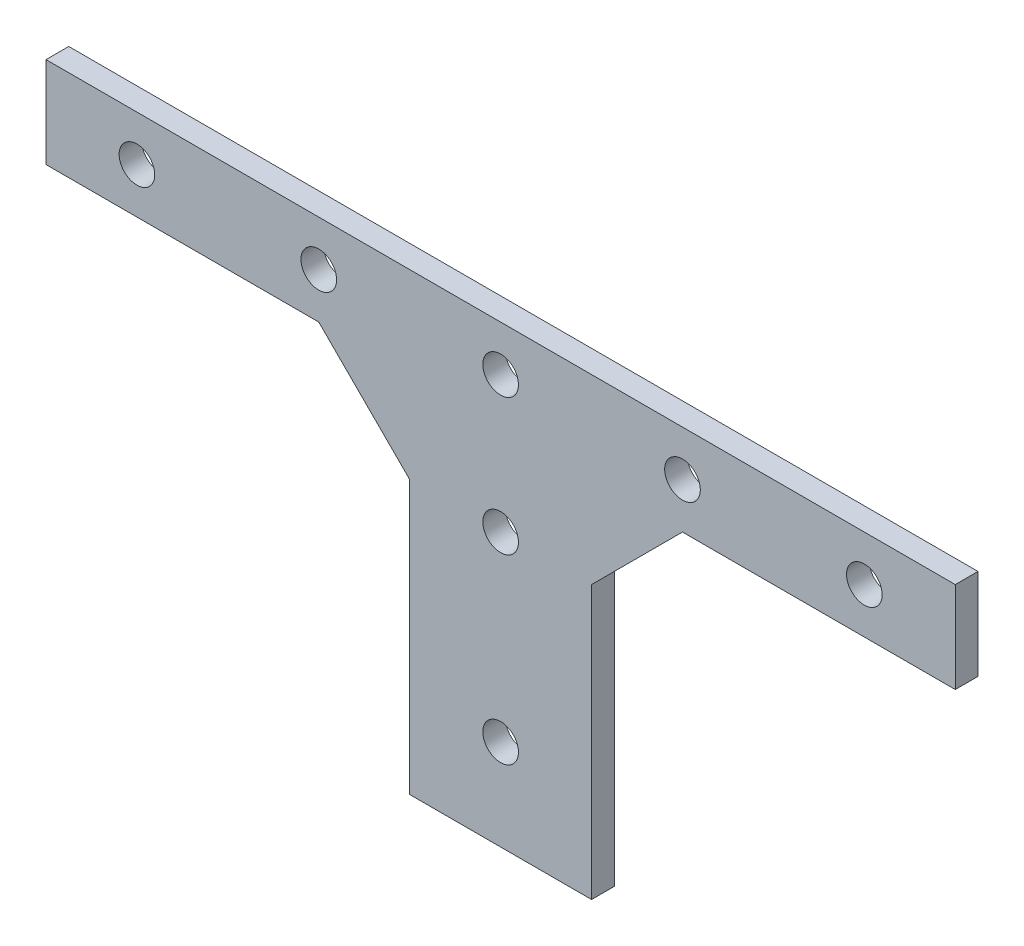
ISO-10303-21;
HEADER;
FILE_DESCRIPTION(('STEP AP214'),'2;1');
FILE_NAME('part.step','',(''),(''),'','','');
FILE_SCHEMA(('AUTOMOTIVE_DESIGN { 1 0 10303 214 1 1 1 1 }'));
ENDSEC;
DATA;
#1=APPLICATION_CONTEXT('core data for automotive mechanical design processes');
#2=APPLICATION_PROTOCOL_DEFINITION('international standard','automotive_design',2000,#1);
#3=PRODUCT_CONTEXT('',#1,'mechanical');
#4=PRODUCT('Part','Part','',(#3));
#5=PRODUCT_RELATED_PRODUCT_CATEGORY('part','',(#4));
#6=PRODUCT_DEFINITION_FORMATION('','',#4);
#7=PRODUCT_DEFINITION_CONTEXT('part definition',#1,'design');
#8=PRODUCT_DEFINITION('design','',#6,#7);
#9=PRODUCT_DEFINITION_SHAPE('','',#8);
#10=(LENGTH_UNIT() NAMED_UNIT(*) SI_UNIT(.MILLI.,.METRE.));
#11=(NAMED_UNIT(*) PLANE_ANGLE_UNIT() SI_UNIT($,.RADIAN.));
#12=(NAMED_UNIT(*) SI_UNIT($,.STERADIAN.) SOLID_ANGLE_UNIT());
#13=UNCERTAINTY_MEASURE_WITH_UNIT(LENGTH_MEASURE(1.E-05),#10,'distance_accuracy_value','');
#14=(GEOMETRIC_REPRESENTATION_CONTEXT(3) GLOBAL_UNCERTAINTY_ASSIGNED_CONTEXT((#13)) GLOBAL_UNIT_ASSIGNED_CONTEXT((#10,
#11,#12)) REPRESENTATION_CONTEXT('',''));
#15=CARTESIAN_POINT('',(0.,0.,0.));
#16=DIRECTION('',(0.,0.,1.));
#17=DIRECTION('',(1.,0.,0.));
#18=AXIS2_PLACEMENT_3D('',#15,#16,#17);
#19=CARTESIAN_POINT('',(41.2749999999985,-63.5,3.175));
#20=DIRECTION('',(0.,1.,0.));
#21=DIRECTION('',(0.,0.,1.));
#22=AXIS2_PLACEMENT_3D('',#19,#20,#21);
#23=PLANE('',#22);
#24=DIRECTION('',(1.,0.,0.));
#25=VECTOR('',#24,1.);
#26=CARTESIAN_POINT('',(41.2749999999985,-63.5,0.));
#27=LINE('',#26,#25);
#28=CARTESIAN_POINT('',(41.2749999999985,-63.5,0.));
#29=VERTEX_POINT('',#28);
#30=CARTESIAN_POINT('',(66.6749999999986,-63.5,0.));
#31=VERTEX_POINT('',#30);
#32=EDGE_CURVE('E155',#29,#31,#27,.T.);
#33=ORIENTED_EDGE('',*,*,#32,.T.);
#34=DIRECTION('',(0.,0.,-1.));
#35=VECTOR('',#34,1.);
#36=CARTESIAN_POINT('',(66.6749999999986,-63.5,3.175));
#37=LINE('',#36,#35);
#38=CARTESIAN_POINT('',(66.6749999999986,-63.5,3.175));
#39=VERTEX_POINT('',#38);
#40=EDGE_CURVE('E11',#39,#31,#37,.T.);
#41=ORIENTED_EDGE('',*,*,#40,.F.);
#42=DIRECTION('',(1.,0.,0.));
#43=VECTOR('',#42,1.);
#44=CARTESIAN_POINT('',(41.2749999999985,-63.5,3.175));
#45=LINE('',#44,#43);
#46=CARTESIAN_POINT('',(41.2749999999985,-63.5,3.175));
#47=VERTEX_POINT('',#46);
#48=EDGE_CURVE('E184',#47,#39,#45,.T.);
#49=ORIENTED_EDGE('',*,*,#48,.F.);
#50=DIRECTION('',(0.,0.,-1.));
#51=VECTOR('',#50,1.);
#52=CARTESIAN_POINT('',(41.2749999999985,-63.5,3.175));
#53=LINE('',#52,#51);
#54=EDGE_CURVE('E151',#47,#29,#53,.T.);
#55=ORIENTED_EDGE('',*,*,#54,.T.);
#56=EDGE_LOOP('',(#33,#41,#49,#55));
#57=FACE_BOUND('',#56,.T.);
#58=ADVANCED_FACE('F42',(#57),#23,.F.);
#59=CARTESIAN_POINT('',(66.6749999999986,-63.5,3.175));
#60=DIRECTION('',(-1.,0.,0.));
#61=DIRECTION('',(0.,0.,1.));
#62=AXIS2_PLACEMENT_3D('',#59,#60,#61);
#63=PLANE('',#62);
#64=DIRECTION('',(0.,1.,0.));
#65=VECTOR('',#64,1.);
#66=CARTESIAN_POINT('',(66.6749999999986,-63.5,0.));
#67=LINE('',#66,#65);
#68=CARTESIAN_POINT('',(66.6749999999986,-25.4,0.));
#69=VERTEX_POINT('',#68);
#70=EDGE_CURVE('E159',#31,#69,#67,.T.);
#71=ORIENTED_EDGE('',*,*,#70,.T.);
#72=DIRECTION('',(0.,0.,-1.));
#73=VECTOR('',#72,1.);
#74=CARTESIAN_POINT('',(66.6749999999986,-25.4,3.175));
#75=LINE('',#74,#73);
#76=CARTESIAN_POINT('',(66.6749999999986,-25.4,3.175));
#77=VERTEX_POINT('',#76);
#78=EDGE_CURVE('E51',#77,#69,#75,.T.);
#79=ORIENTED_EDGE('',*,*,#78,.F.);
#80=DIRECTION('',(0.,1.,0.));
#81=VECTOR('',#80,1.);
#82=CARTESIAN_POINT('',(66.6749999999986,-63.5,3.175));
#83=LINE('',#82,#81);
#84=EDGE_CURVE('E108',#39,#77,#83,.T.);
#85=ORIENTED_EDGE('',*,*,#84,.F.);
#86=ORIENTED_EDGE('',*,*,#40,.T.);
#87=EDGE_LOOP('',(#71,#79,#85,#86));
#88=FACE_BOUND('',#87,.T.);
#89=ADVANCED_FACE('F336',(#88),#63,.F.);
#90=CARTESIAN_POINT('',(66.6749999999986,-25.4,3.175));
#91=DIRECTION('',(-0.707106781186562,0.707106781186533,0.));
#92=DIRECTION('',(-0.707106781186533,-0.707106781186562,0.));
#93=AXIS2_PLACEMENT_3D('',#90,#91,#92);
#94=PLANE('',#93);
#95=DIRECTION('',(0.707106781186533,0.707106781186562,0.));
#96=VECTOR('',#95,1.);
#97=CARTESIAN_POINT('',(66.6749999999986,-25.4,0.));
#98=LINE('',#97,#96);
#99=CARTESIAN_POINT('',(79.3749999999981,-12.7,0.));
#100=VERTEX_POINT('',#99);
#101=EDGE_CURVE('E163',#69,#100,#98,.T.);
#102=ORIENTED_EDGE('',*,*,#101,.T.);
#103=DIRECTION('',(0.,0.,-1.));
#104=VECTOR('',#103,1.);
#105=CARTESIAN_POINT('',(79.3749999999981,-12.7,3.175));
#106=LINE('',#105,#104);
#107=CARTESIAN_POINT('',(79.3749999999981,-12.7,3.175));
#108=VERTEX_POINT('',#107);
#109=EDGE_CURVE('E203',#108,#100,#106,.T.);
#110=ORIENTED_EDGE('',*,*,#109,.F.);
#111=DIRECTION('',(0.707106781186533,0.707106781186562,0.));
#112=VECTOR('',#111,1.);
#113=CARTESIAN_POINT('',(66.6749999999986,-25.4,3.175));
#114=LINE('',#113,#112);
#115=EDGE_CURVE('E213',#77,#108,#114,.T.);
#116=ORIENTED_EDGE('',*,*,#115,.F.);
#117=ORIENTED_EDGE('',*,*,#78,.T.);
#118=EDGE_LOOP('',(#102,#110,#116,#117));
#119=FACE_BOUND('',#118,.T.);
#120=ADVANCED_FACE('F211',(#119),#94,.F.);
#121=CARTESIAN_POINT('',(79.3749999999981,-12.7,3.175));
#122=DIRECTION('',(0.,1.,0.));
#123=DIRECTION('',(-1.,0.,0.));
#124=AXIS2_PLACEMENT_3D('',#121,#122,#123);
#125=PLANE('',#124);
#126=DIRECTION('',(1.,0.,0.));
#127=VECTOR('',#126,1.);
#128=CARTESIAN_POINT('',(79.3749999999981,-12.7,0.));
#129=LINE('',#128,#127);
#130=CARTESIAN_POINT('',(117.474999999999,-12.6999999999999,0.));
#131=VERTEX_POINT('',#130);
#132=EDGE_CURVE('E166',#100,#131,#129,.T.);
#133=ORIENTED_EDGE('',*,*,#132,.T.);
#134=DIRECTION('',(0.,0.,-1.));
#135=VECTOR('',#134,1.);
#136=CARTESIAN_POINT('',(117.474999999999,-12.6999999999999,3.175));
#137=LINE('',#136,#135);
#138=CARTESIAN_POINT('',(117.474999999999,-12.6999999999999,3.175));
#139=VERTEX_POINT('',#138);
#140=EDGE_CURVE('E199',#139,#131,#137,.T.);
#141=ORIENTED_EDGE('',*,*,#140,.F.);
#142=DIRECTION('',(1.,0.,0.));
#143=VECTOR('',#142,1.);
#144=CARTESIAN_POINT('',(79.3749999999981,-12.7,3.175));
#145=LINE('',#144,#143);
#146=EDGE_CURVE('E232',#108,#139,#145,.T.);
#147=ORIENTED_EDGE('',*,*,#146,.F.);
#148=ORIENTED_EDGE('',*,*,#109,.T.);
#149=EDGE_LOOP('',(#133,#141,#147,#148));
#150=FACE_BOUND('',#149,.T.);
#151=ADVANCED_FACE('F222',(#150),#125,.F.);
#152=CARTESIAN_POINT('',(117.474999999999,-12.6999999999999,3.175));
#153=DIRECTION('',(-1.,0.,0.));
#154=DIRECTION('',(0.,0.,1.));
#155=AXIS2_PLACEMENT_3D('',#152,#153,#154);
#156=PLANE('',#155);
#157=DIRECTION('',(0.,1.,0.));
#158=VECTOR('',#157,1.);
#159=CARTESIAN_POINT('',(117.474999999999,-12.6999999999999,0.));
#160=LINE('',#159,#158);
#161=CARTESIAN_POINT('',(117.474999999999,-3.33066907387547E-13,0.));
#162=VERTEX_POINT('',#161);
#163=EDGE_CURVE('E169',#131,#162,#160,.T.);
#164=ORIENTED_EDGE('',*,*,#163,.T.);
#165=DIRECTION('',(0.,0.,-1.));
#166=VECTOR('',#165,1.);
#167=CARTESIAN_POINT('',(117.474999999999,-3.33066907387547E-13,3.175));
#168=LINE('',#167,#166);
#169=CARTESIAN_POINT('',(117.474999999999,-3.33066907387547E-13,3.175));
#170=VERTEX_POINT('',#169);
#171=EDGE_CURVE('E195',#170,#162,#168,.T.);
#172=ORIENTED_EDGE('',*,*,#171,.F.);
#173=DIRECTION('',(0.,1.,0.));
#174=VECTOR('',#173,1.);
#175=CARTESIAN_POINT('',(117.474999999999,-12.6999999999999,3.175));
#176=LINE('',#175,#174);
#177=EDGE_CURVE('E228',#139,#170,#176,.T.);
#178=ORIENTED_EDGE('',*,*,#177,.F.);
#179=ORIENTED_EDGE('',*,*,#140,.T.);
#180=EDGE_LOOP('',(#164,#172,#178,#179));
#181=FACE_BOUND('',#180,.T.);
#182=ADVANCED_FACE('F226',(#181),#156,.F.);
#183=CARTESIAN_POINT('',(117.474999999999,-3.33066907387547E-13,3.175));
#184=DIRECTION('',(0.,-1.,0.));
#185=DIRECTION('',(0.,0.,-1.));
#186=AXIS2_PLACEMENT_3D('',#183,#184,#185);
#187=PLANE('',#186);
#188=DIRECTION('',(-1.,0.,0.));
#189=VECTOR('',#188,1.);
#190=CARTESIAN_POINT('',(117.474999999999,-3.33066907387547E-13,0.));
#191=LINE('',#190,#189);
#192=CARTESIAN_POINT('',(-9.52500000000145,-3.33066907387547E-13,0.));
#193=VERTEX_POINT('',#192);
#194=EDGE_CURVE('E172',#162,#193,#191,.T.);
#195=ORIENTED_EDGE('',*,*,#194,.T.);
#196=DIRECTION('',(0.,0.,-1.));
#197=VECTOR('',#196,1.);
#198=CARTESIAN_POINT('',(-9.52500000000145,-3.33066907387547E-13,3.175));
#199=LINE('',#198,#197);
#200=CARTESIAN_POINT('',(-9.52500000000145,-3.33066907387547E-13,3.175));
#201=VERTEX_POINT('',#200);
#202=EDGE_CURVE('E191',#201,#193,#199,.T.);
#203=ORIENTED_EDGE('',*,*,#202,.F.);
#204=DIRECTION('',(-1.,0.,0.));
#205=VECTOR('',#204,1.);
#206=CARTESIAN_POINT('',(117.474999999999,-3.33066907387547E-13,3.175));
#207=LINE('',#206,#205);
#208=EDGE_CURVE('E231',#170,#201,#207,.T.);
#209=ORIENTED_EDGE('',*,*,#208,.F.);
#210=ORIENTED_EDGE('',*,*,#171,.T.);
#211=EDGE_LOOP('',(#195,#203,#209,#210));
#212=FACE_BOUND('',#211,.T.);
#213=ADVANCED_FACE('F348',(#212),#187,.F.);
#214=CARTESIAN_POINT('',(-9.52500000000145,-3.33066907387547E-13,3.175));
#215=DIRECTION('',(1.,0.,0.));
#216=DIRECTION('',(0.,0.,-1.));
#217=AXIS2_PLACEMENT_3D('',#214,#215,#216);
#218=PLANE('',#217);
#219=DIRECTION('',(0.,-1.,0.));
#220=VECTOR('',#219,1.);
#221=CARTESIAN_POINT('',(-9.52500000000145,-3.33066907387547E-13,0.));
#222=LINE('',#221,#220);
#223=CARTESIAN_POINT('',(-9.52500000000145,-12.6999999999999,0.));
#224=VERTEX_POINT('',#223);
#225=EDGE_CURVE('E175',#193,#224,#222,.T.);
#226=ORIENTED_EDGE('',*,*,#225,.T.);
#227=DIRECTION('',(0.,0.,-1.));
#228=VECTOR('',#227,1.);
#229=CARTESIAN_POINT('',(-9.52500000000145,-12.6999999999999,3.175));
#230=LINE('',#229,#228);
#231=CARTESIAN_POINT('',(-9.52500000000145,-12.6999999999999,3.175));
#232=VERTEX_POINT('',#231);
#233=EDGE_CURVE('E144',#232,#224,#230,.T.);
#234=ORIENTED_EDGE('',*,*,#233,.F.);
#235=DIRECTION('',(0.,-1.,0.));
#236=VECTOR('',#235,1.);
#237=CARTESIAN_POINT('',(-9.52500000000145,-3.33066907387547E-13,3.175));
#238=LINE('',#237,#236);
#239=EDGE_CURVE('E133',#201,#232,#238,.T.);
#240=ORIENTED_EDGE('',*,*,#239,.F.);
#241=ORIENTED_EDGE('',*,*,#202,.T.);
#242=EDGE_LOOP('',(#226,#234,#240,#241));
#243=FACE_BOUND('',#242,.T.);
#244=ADVANCED_FACE('F345',(#243),#218,.F.);
#245=CARTESIAN_POINT('',(-9.52500000000145,-12.6999999999999,3.175));
#246=DIRECTION('',(0.,1.,0.));
#247=DIRECTION('',(-1.,0.,0.));
#248=AXIS2_PLACEMENT_3D('',#245,#246,#247);
#249=PLANE('',#248);
#250=DIRECTION('',(1.,0.,0.));
#251=VECTOR('',#250,1.);
#252=CARTESIAN_POINT('',(-9.52500000000145,-12.6999999999999,0.));
#253=LINE('',#252,#251);
#254=CARTESIAN_POINT('',(28.5749999999979,-12.7,0.));
#255=VERTEX_POINT('',#254);
#256=EDGE_CURVE('E142',#224,#255,#253,.T.);
#257=ORIENTED_EDGE('',*,*,#256,.T.);
#258=DIRECTION('',(0.,0.,-1.));
#259=VECTOR('',#258,1.);
#260=CARTESIAN_POINT('',(28.5749999999979,-12.7,3.175));
#261=LINE('',#260,#259);
#262=CARTESIAN_POINT('',(28.5749999999979,-12.7,3.175));
#263=VERTEX_POINT('',#262);
#264=EDGE_CURVE('E139',#263,#255,#261,.T.);
#265=ORIENTED_EDGE('',*,*,#264,.F.);
#266=DIRECTION('',(1.,0.,0.));
#267=VECTOR('',#266,1.);
#268=CARTESIAN_POINT('',(-9.52500000000145,-12.6999999999999,3.175));
#269=LINE('',#268,#267);
#270=EDGE_CURVE('E127',#232,#263,#269,.T.);
#271=ORIENTED_EDGE('',*,*,#270,.F.);
#272=ORIENTED_EDGE('',*,*,#233,.T.);
#273=EDGE_LOOP('',(#257,#265,#271,#272));
#274=FACE_BOUND('',#273,.T.);
#275=ADVANCED_FACE('F140',(#274),#249,.F.);
#276=CARTESIAN_POINT('',(41.2749999999986,-25.4,3.175));
#277=DIRECTION('',(0.70710678118653,0.707106781186564,0.));
#278=DIRECTION('',(-0.707106781186565,0.70710678118653,0.));
#279=AXIS2_PLACEMENT_3D('',#276,#277,#278);
#280=PLANE('',#279);
#281=DIRECTION('',(0.707106781186565,-0.70710678118653,0.));
#282=VECTOR('',#281,1.);
#283=CARTESIAN_POINT('',(41.2749999999986,-25.4,0.));
#284=LINE('',#283,#282);
#285=CARTESIAN_POINT('',(41.2749999999986,-25.4,0.));
#286=VERTEX_POINT('',#285);
#287=EDGE_CURVE('E94',#255,#286,#284,.T.);
#288=ORIENTED_EDGE('',*,*,#287,.T.);
#289=DIRECTION('',(0.,0.,-1.));
#290=VECTOR('',#289,1.);
#291=CARTESIAN_POINT('',(41.2749999999986,-25.4,3.175));
#292=LINE('',#291,#290);
#293=CARTESIAN_POINT('',(41.2749999999986,-25.4,3.175));
#294=VERTEX_POINT('',#293);
#295=EDGE_CURVE('E145',#294,#286,#292,.T.);
#296=ORIENTED_EDGE('',*,*,#295,.F.);
#297=DIRECTION('',(0.707106781186565,-0.70710678118653,0.));
#298=VECTOR('',#297,1.);
#299=CARTESIAN_POINT('',(41.2749999999986,-25.4,3.175));
#300=LINE('',#299,#298);
#301=EDGE_CURVE('E131',#263,#294,#300,.T.);
#302=ORIENTED_EDGE('',*,*,#301,.F.);
#303=ORIENTED_EDGE('',*,*,#264,.T.);
#304=EDGE_LOOP('',(#288,#296,#302,#303));
#305=FACE_BOUND('',#304,.T.);
#306=ADVANCED_FACE('F147',(#305),#280,.F.);
#307=CARTESIAN_POINT('',(41.2749999999986,-25.4,3.175));
#308=DIRECTION('',(1.,0.,0.));
#309=DIRECTION('',(0.,1.,0.));
#310=AXIS2_PLACEMENT_3D('',#307,#308,#309);
#311=PLANE('',#310);
#312=DIRECTION('',(0.,-1.,0.));
#313=VECTOR('',#312,1.);
#314=CARTESIAN_POINT('',(41.2749999999986,-25.4,0.));
#315=LINE('',#314,#313);
#316=EDGE_CURVE('E100',#286,#29,#315,.T.);
#317=ORIENTED_EDGE('',*,*,#316,.T.);
#318=ORIENTED_EDGE('',*,*,#54,.F.);
#319=DIRECTION('',(0.,-1.,0.));
#320=VECTOR('',#319,1.);
#321=CARTESIAN_POINT('',(41.2749999999986,-25.4,3.175));
#322=LINE('',#321,#320);
#323=EDGE_CURVE('E59',#294,#47,#322,.T.);
#324=ORIENTED_EDGE('',*,*,#323,.F.);
#325=ORIENTED_EDGE('',*,*,#295,.T.);
#326=EDGE_LOOP('',(#317,#318,#324,#325));
#327=FACE_BOUND('',#326,.T.);
#328=ADVANCED_FACE('F306',(#327),#311,.F.);
#329=CARTESIAN_POINT('',(0.,0.,3.175));
#330=DIRECTION('',(0.,0.,1.));
#331=DIRECTION('',(1.,0.,0.));
#332=AXIS2_PLACEMENT_3D('',#329,#330,#331);
#333=PLANE('',#332);
#334=CARTESIAN_POINT('',(3.17499999999792,-6.35000000000014,3.175));
#335=DIRECTION('',(0.,0.,1.));
#336=DIRECTION('',(1.,0.,0.));
#337=AXIS2_PLACEMENT_3D('',#334,#335,#336);
#338=CIRCLE('',#337,2.48919999999999);
#339=CARTESIAN_POINT('',(5.66419999999791,-6.35000000000014,3.175));
#340=VERTEX_POINT('',#339);
#341=EDGE_CURVE('E297',#340,#340,#338,.T.);
#342=ORIENTED_EDGE('',*,*,#341,.F.);
#343=EDGE_LOOP('',(#342));
#344=FACE_BOUND('',#343,.T.);
#345=CARTESIAN_POINT('',(28.5749999999979,-6.35000000000014,3.175));
#346=DIRECTION('',(0.,0.,1.));
#347=DIRECTION('',(1.,0.,0.));
#348=AXIS2_PLACEMENT_3D('',#345,#346,#347);
#349=CIRCLE('',#348,2.48919999999999);
#350=CARTESIAN_POINT('',(31.0641999999979,-6.35000000000014,3.175));
#351=VERTEX_POINT('',#350);
#352=EDGE_CURVE('E289',#351,#351,#349,.T.);
#353=ORIENTED_EDGE('',*,*,#352,.F.);
#354=EDGE_LOOP('',(#353));
#355=FACE_BOUND('',#354,.T.);
#356=CARTESIAN_POINT('',(53.9749999999986,-6.35000000000014,3.175));
#357=DIRECTION('',(0.,0.,1.));
#358=DIRECTION('',(1.,0.,0.));
#359=AXIS2_PLACEMENT_3D('',#356,#357,#358);
#360=CIRCLE('',#359,2.48919999999999);
#361=CARTESIAN_POINT('',(56.4641999999985,-6.35000000000014,3.175));
#362=VERTEX_POINT('',#361);
#363=EDGE_CURVE('E281',#362,#362,#360,.T.);
#364=ORIENTED_EDGE('',*,*,#363,.F.);
#365=EDGE_LOOP('',(#364));
#366=FACE_BOUND('',#365,.T.);
#367=CARTESIAN_POINT('',(104.774999999999,-6.35000000000014,3.175));
#368=DIRECTION('',(0.,0.,1.));
#369=DIRECTION('',(1.,0.,0.));
#370=AXIS2_PLACEMENT_3D('',#367,#368,#369);
#371=CIRCLE('',#370,2.48919999999998);
#372=CARTESIAN_POINT('',(107.264199999999,-6.35000000000014,3.175));
#373=VERTEX_POINT('',#372);
#374=EDGE_CURVE('E273',#373,#373,#371,.T.);
#375=ORIENTED_EDGE('',*,*,#374,.F.);
#376=EDGE_LOOP('',(#375));
#377=FACE_BOUND('',#376,.T.);
#378=CARTESIAN_POINT('',(53.9749999999986,-25.3999999999999,3.175));
#379=DIRECTION('',(0.,0.,1.));
#380=DIRECTION('',(1.,0.,0.));
#381=AXIS2_PLACEMENT_3D('',#378,#379,#380);
#382=CIRCLE('',#381,2.48919999999999);
#383=CARTESIAN_POINT('',(56.4641999999985,-25.3999999999999,3.175));
#384=VERTEX_POINT('',#383);
#385=EDGE_CURVE('E265',#384,#384,#382,.T.);
#386=ORIENTED_EDGE('',*,*,#385,.F.);
#387=EDGE_LOOP('',(#386));
#388=FACE_BOUND('',#387,.T.);
#389=CARTESIAN_POINT('',(53.9749999999986,-50.7999999999999,3.175));
#390=DIRECTION('',(0.,0.,1.));
#391=DIRECTION('',(1.,0.,0.));
#392=AXIS2_PLACEMENT_3D('',#389,#390,#391);
#393=CIRCLE('',#392,2.48919999999999);
#394=CARTESIAN_POINT('',(56.4641999999985,-50.7999999999999,3.175));
#395=VERTEX_POINT('',#394);
#396=EDGE_CURVE('E257',#395,#395,#393,.T.);
#397=ORIENTED_EDGE('',*,*,#396,.F.);
#398=EDGE_LOOP('',(#397));
#399=FACE_BOUND('',#398,.T.);
#400=CARTESIAN_POINT('',(79.3749999999981,-6.35000000000014,3.175));
#401=DIRECTION('',(0.,0.,1.));
#402=DIRECTION('',(1.,0.,0.));
#403=AXIS2_PLACEMENT_3D('',#400,#401,#402);
#404=CIRCLE('',#403,2.48919999999998);
#405=CARTESIAN_POINT('',(81.864199999998,-6.35000000000014,3.175));
#406=VERTEX_POINT('',#405);
#407=EDGE_CURVE('E249',#406,#406,#404,.T.);
#408=ORIENTED_EDGE('',*,*,#407,.F.);
#409=EDGE_LOOP('',(#408));
#410=FACE_BOUND('',#409,.T.);
#411=ORIENTED_EDGE('',*,*,#48,.T.);
#412=ORIENTED_EDGE('',*,*,#84,.T.);
#413=ORIENTED_EDGE('',*,*,#115,.T.);
#414=ORIENTED_EDGE('',*,*,#146,.T.);
#415=ORIENTED_EDGE('',*,*,#177,.T.);
#416=ORIENTED_EDGE('',*,*,#208,.T.);
#417=ORIENTED_EDGE('',*,*,#239,.T.);
#418=ORIENTED_EDGE('',*,*,#270,.T.);
#419=ORIENTED_EDGE('',*,*,#301,.T.);
#420=ORIENTED_EDGE('',*,*,#323,.T.);
#421=EDGE_LOOP('',(#411,#412,#413,#414,#415,#416,#417,#418,#419,#420));
#422=FACE_BOUND('',#421,.T.);
#423=ADVANCED_FACE('F129',(#344,#355,#366,#377,#388,#399,#410,#422),#333,.T.);
#424=CARTESIAN_POINT('',(0.,0.,0.));
#425=DIRECTION('',(0.,0.,1.));
#426=DIRECTION('',(1.,0.,0.));
#427=AXIS2_PLACEMENT_3D('',#424,#425,#426);
#428=PLANE('',#427);
#429=CARTESIAN_POINT('',(3.17499999999792,-6.35000000000014,0.));
#430=DIRECTION('',(0.,0.,1.));
#431=DIRECTION('',(1.,0.,0.));
#432=AXIS2_PLACEMENT_3D('',#429,#430,#431);
#433=CIRCLE('',#432,2.48919999999999);
#434=CARTESIAN_POINT('',(5.66419999999791,-6.35000000000014,0.));
#435=VERTEX_POINT('',#434);
#436=EDGE_CURVE('E293',#435,#435,#433,.T.);
#437=ORIENTED_EDGE('',*,*,#436,.T.);
#438=EDGE_LOOP('',(#437));
#439=FACE_BOUND('',#438,.T.);
#440=CARTESIAN_POINT('',(28.5749999999979,-6.35000000000014,0.));
#441=DIRECTION('',(0.,0.,1.));
#442=DIRECTION('',(1.,0.,0.));
#443=AXIS2_PLACEMENT_3D('',#440,#441,#442);
#444=CIRCLE('',#443,2.48919999999999);
#445=CARTESIAN_POINT('',(31.0641999999979,-6.35000000000014,0.));
#446=VERTEX_POINT('',#445);
#447=EDGE_CURVE('E285',#446,#446,#444,.T.);
#448=ORIENTED_EDGE('',*,*,#447,.T.);
#449=EDGE_LOOP('',(#448));
#450=FACE_BOUND('',#449,.T.);
#451=CARTESIAN_POINT('',(53.9749999999986,-6.35000000000014,0.));
#452=DIRECTION('',(0.,0.,1.));
#453=DIRECTION('',(1.,0.,0.));
#454=AXIS2_PLACEMENT_3D('',#451,#452,#453);
#455=CIRCLE('',#454,2.48919999999999);
#456=CARTESIAN_POINT('',(56.4641999999985,-6.35000000000014,0.));
#457=VERTEX_POINT('',#456);
#458=EDGE_CURVE('E277',#457,#457,#455,.T.);
#459=ORIENTED_EDGE('',*,*,#458,.T.);
#460=EDGE_LOOP('',(#459));
#461=FACE_BOUND('',#460,.T.);
#462=CARTESIAN_POINT('',(104.774999999999,-6.35000000000014,0.));
#463=DIRECTION('',(0.,0.,1.));
#464=DIRECTION('',(1.,0.,0.));
#465=AXIS2_PLACEMENT_3D('',#462,#463,#464);
#466=CIRCLE('',#465,2.48919999999998);
#467=CARTESIAN_POINT('',(107.264199999999,-6.35000000000014,0.));
#468=VERTEX_POINT('',#467);
#469=EDGE_CURVE('E269',#468,#468,#466,.T.);
#470=ORIENTED_EDGE('',*,*,#469,.T.);
#471=EDGE_LOOP('',(#470));
#472=FACE_BOUND('',#471,.T.);
#473=CARTESIAN_POINT('',(53.9749999999986,-25.3999999999999,0.));
#474=DIRECTION('',(0.,0.,1.));
#475=DIRECTION('',(1.,0.,0.));
#476=AXIS2_PLACEMENT_3D('',#473,#474,#475);
#477=CIRCLE('',#476,2.48919999999999);
#478=CARTESIAN_POINT('',(56.4641999999985,-25.3999999999999,0.));
#479=VERTEX_POINT('',#478);
#480=EDGE_CURVE('E261',#479,#479,#477,.T.);
#481=ORIENTED_EDGE('',*,*,#480,.T.);
#482=EDGE_LOOP('',(#481));
#483=FACE_BOUND('',#482,.T.);
#484=CARTESIAN_POINT('',(53.9749999999986,-50.7999999999999,0.));
#485=DIRECTION('',(0.,0.,1.));
#486=DIRECTION('',(1.,0.,0.));
#487=AXIS2_PLACEMENT_3D('',#484,#485,#486);
#488=CIRCLE('',#487,2.48919999999999);
#489=CARTESIAN_POINT('',(56.4641999999985,-50.7999999999999,0.));
#490=VERTEX_POINT('',#489);
#491=EDGE_CURVE('E253',#490,#490,#488,.T.);
#492=ORIENTED_EDGE('',*,*,#491,.T.);
#493=EDGE_LOOP('',(#492));
#494=FACE_BOUND('',#493,.T.);
#495=CARTESIAN_POINT('',(79.3749999999981,-6.35000000000014,0.));
#496=DIRECTION('',(0.,0.,1.));
#497=DIRECTION('',(1.,0.,0.));
#498=AXIS2_PLACEMENT_3D('',#495,#496,#497);
#499=CIRCLE('',#498,2.48919999999998);
#500=CARTESIAN_POINT('',(81.864199999998,-6.35000000000014,0.));
#501=VERTEX_POINT('',#500);
#502=EDGE_CURVE('E160',#501,#501,#499,.T.);
#503=ORIENTED_EDGE('',*,*,#502,.T.);
#504=EDGE_LOOP('',(#503));
#505=FACE_BOUND('',#504,.T.);
#506=ORIENTED_EDGE('',*,*,#32,.F.);
#507=ORIENTED_EDGE('',*,*,#316,.F.);
#508=ORIENTED_EDGE('',*,*,#287,.F.);
#509=ORIENTED_EDGE('',*,*,#256,.F.);
#510=ORIENTED_EDGE('',*,*,#225,.F.);
#511=ORIENTED_EDGE('',*,*,#194,.F.);
#512=ORIENTED_EDGE('',*,*,#163,.F.);
#513=ORIENTED_EDGE('',*,*,#132,.F.);
#514=ORIENTED_EDGE('',*,*,#101,.F.);
#515=ORIENTED_EDGE('',*,*,#70,.F.);
#516=EDGE_LOOP('',(#506,#507,#508,#509,#510,#511,#512,#513,#514,#515));
#517=FACE_BOUND('',#516,.T.);
#518=ADVANCED_FACE('F217',(#439,#450,#461,#472,#483,#494,#505,#517),#428,.F.);
#519=CARTESIAN_POINT('',(79.3749999999981,-6.35000000000014,3.175));
#520=DIRECTION('',(0.,0.,1.));
#521=DIRECTION('',(1.,0.,0.));
#522=AXIS2_PLACEMENT_3D('',#519,#520,#521);
#523=CYLINDRICAL_SURFACE('',#522,2.48919999999998);
#524=ORIENTED_EDGE('',*,*,#502,.F.);
#525=EDGE_LOOP('',(#524));
#526=FACE_BOUND('',#525,.T.);
#527=ORIENTED_EDGE('',*,*,#407,.T.);
#528=EDGE_LOOP('',(#527));
#529=FACE_BOUND('',#528,.T.);
#530=ADVANCED_FACE('F320',(#526,#529),#523,.F.);
#531=CARTESIAN_POINT('',(53.9749999999986,-50.7999999999999,3.175));
#532=DIRECTION('',(0.,0.,1.));
#533=DIRECTION('',(1.,0.,0.));
#534=AXIS2_PLACEMENT_3D('',#531,#532,#533);
#535=CYLINDRICAL_SURFACE('',#534,2.48919999999999);
#536=ORIENTED_EDGE('',*,*,#491,.F.);
#537=EDGE_LOOP('',(#536));
#538=FACE_BOUND('',#537,.T.);
#539=ORIENTED_EDGE('',*,*,#396,.T.);
#540=EDGE_LOOP('',(#539));
#541=FACE_BOUND('',#540,.T.);
#542=ADVANCED_FACE('F322',(#538,#541),#535,.F.);
#543=CARTESIAN_POINT('',(53.9749999999986,-25.3999999999999,3.175));
#544=DIRECTION('',(0.,0.,1.));
#545=DIRECTION('',(1.,0.,0.));
#546=AXIS2_PLACEMENT_3D('',#543,#544,#545);
#547=CYLINDRICAL_SURFACE('',#546,2.48919999999999);
#548=ORIENTED_EDGE('',*,*,#480,.F.);
#549=EDGE_LOOP('',(#548));
#550=FACE_BOUND('',#549,.T.);
#551=ORIENTED_EDGE('',*,*,#385,.T.);
#552=EDGE_LOOP('',(#551));
#553=FACE_BOUND('',#552,.T.);
#554=ADVANCED_FACE('F329',(#550,#553),#547,.F.);
#555=CARTESIAN_POINT('',(104.774999999999,-6.35000000000014,3.175));
#556=DIRECTION('',(0.,0.,1.));
#557=DIRECTION('',(1.,0.,0.));
#558=AXIS2_PLACEMENT_3D('',#555,#556,#557);
#559=CYLINDRICAL_SURFACE('',#558,2.48919999999998);
#560=ORIENTED_EDGE('',*,*,#469,.F.);
#561=EDGE_LOOP('',(#560));
#562=FACE_BOUND('',#561,.T.);
#563=ORIENTED_EDGE('',*,*,#374,.T.);
#564=EDGE_LOOP('',(#563));
#565=FACE_BOUND('',#564,.T.);
#566=ADVANCED_FACE('F448',(#562,#565),#559,.F.);
#567=CARTESIAN_POINT('',(53.9749999999986,-6.35000000000014,3.175));
#568=DIRECTION('',(0.,0.,1.));
#569=DIRECTION('',(1.,0.,0.));
#570=AXIS2_PLACEMENT_3D('',#567,#568,#569);
#571=CYLINDRICAL_SURFACE('',#570,2.48919999999999);
#572=ORIENTED_EDGE('',*,*,#458,.F.);
#573=EDGE_LOOP('',(#572));
#574=FACE_BOUND('',#573,.T.);
#575=ORIENTED_EDGE('',*,*,#363,.T.);
#576=EDGE_LOOP('',(#575));
#577=FACE_BOUND('',#576,.T.);
#578=ADVANCED_FACE('F459',(#574,#577),#571,.F.);
#579=CARTESIAN_POINT('',(28.5749999999979,-6.35000000000014,3.175));
#580=DIRECTION('',(0.,0.,1.));
#581=DIRECTION('',(1.,0.,0.));
#582=AXIS2_PLACEMENT_3D('',#579,#580,#581);
#583=CYLINDRICAL_SURFACE('',#582,2.48919999999999);
#584=ORIENTED_EDGE('',*,*,#447,.F.);
#585=EDGE_LOOP('',(#584));
#586=FACE_BOUND('',#585,.T.);
#587=ORIENTED_EDGE('',*,*,#352,.T.);
#588=EDGE_LOOP('',(#587));
#589=FACE_BOUND('',#588,.T.);
#590=ADVANCED_FACE('F470',(#586,#589),#583,.F.);
#591=CARTESIAN_POINT('',(3.17499999999792,-6.35000000000014,3.175));
#592=DIRECTION('',(0.,0.,1.));
#593=DIRECTION('',(1.,0.,0.));
#594=AXIS2_PLACEMENT_3D('',#591,#592,#593);
#595=CYLINDRICAL_SURFACE('',#594,2.48919999999999);
#596=ORIENTED_EDGE('',*,*,#436,.F.);
#597=EDGE_LOOP('',(#596));
#598=FACE_BOUND('',#597,.T.);
#599=ORIENTED_EDGE('',*,*,#341,.T.);
#600=EDGE_LOOP('',(#599));
#601=FACE_BOUND('',#600,.T.);
#602=ADVANCED_FACE('F302',(#598,#601),#595,.F.);
#603=CLOSED_SHELL('',(#58,#89,#120,#151,#182,#213,#244,#275,#306,#328,#423,#518,#530,#542,#554,
#566,#578,#590,#602));
#604=MANIFOLD_SOLID_BREP('B2',#603);
#605=ADVANCED_BREP_SHAPE_REPRESENTATION('',(#18,#604),#14);
#606=SHAPE_DEFINITION_REPRESENTATION(#9,#605);
ENDSEC;
END-ISO-10303-21;
